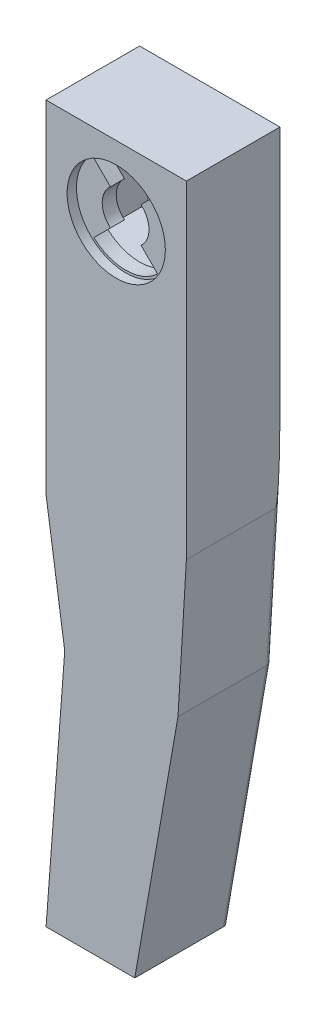
ISO-10303-21;
HEADER;
FILE_DESCRIPTION(('STEP AP214'),'2;1');
FILE_NAME('part.step','',(''),(''),'','','');
FILE_SCHEMA(('AUTOMOTIVE_DESIGN { 1 0 10303 214 1 1 1 1 }'));
ENDSEC;
DATA;
#1=APPLICATION_CONTEXT('core data for automotive mechanical design processes');
#2=APPLICATION_PROTOCOL_DEFINITION('international standard','automotive_design',2000,#1);
#3=PRODUCT_CONTEXT('',#1,'mechanical');
#4=PRODUCT('Part','Part','',(#3));
#5=PRODUCT_RELATED_PRODUCT_CATEGORY('part','',(#4));
#6=PRODUCT_DEFINITION_FORMATION('','',#4);
#7=PRODUCT_DEFINITION_CONTEXT('part definition',#1,'design');
#8=PRODUCT_DEFINITION('design','',#6,#7);
#9=PRODUCT_DEFINITION_SHAPE('','',#8);
#10=(LENGTH_UNIT() NAMED_UNIT(*) SI_UNIT(.MILLI.,.METRE.));
#11=(NAMED_UNIT(*) PLANE_ANGLE_UNIT() SI_UNIT($,.RADIAN.));
#12=(NAMED_UNIT(*) SI_UNIT($,.STERADIAN.) SOLID_ANGLE_UNIT());
#13=UNCERTAINTY_MEASURE_WITH_UNIT(LENGTH_MEASURE(1.E-05),#10,'distance_accuracy_value','');
#14=(GEOMETRIC_REPRESENTATION_CONTEXT(3) GLOBAL_UNCERTAINTY_ASSIGNED_CONTEXT((#13)) GLOBAL_UNIT_ASSIGNED_CONTEXT((#10,
#11,#12)) REPRESENTATION_CONTEXT('',''));
#15=CARTESIAN_POINT('',(0.,0.,0.));
#16=DIRECTION('',(0.,0.,1.));
#17=DIRECTION('',(1.,0.,0.));
#18=AXIS2_PLACEMENT_3D('',#15,#16,#17);
#19=CARTESIAN_POINT('',(-14.4473162010252,0.866838972061505,20.));
#20=DIRECTION('',(0.998204845465779,-0.0598922907279464,0.));
#21=DIRECTION('',(0.0598922907279464,0.998204845465779,0.));
#22=AXIS2_PLACEMENT_3D('',#19,#20,#21);
#23=PLANE('',#22);
#24=DIRECTION('',(0.,0.,-1.));
#25=VECTOR('',#24,1.);
#26=CARTESIAN_POINT('',(-18.7142857142857,-70.2493195822815,20.));
#27=LINE('',#26,#25);
#28=CARTESIAN_POINT('',(-18.7142857142857,-70.2493195822815,20.));
#29=VERTEX_POINT('',#28);
#30=CARTESIAN_POINT('',(-18.7142857142857,-70.2493195822815,1.));
#31=VERTEX_POINT('',#30);
#32=EDGE_CURVE('E234',#29,#31,#27,.T.);
#33=ORIENTED_EDGE('',*,*,#32,.T.);
#34=DIRECTION('',(-0.0598922907279464,-0.998204845465779,0.));
#35=VECTOR('',#34,1.);
#36=CARTESIAN_POINT('',(-16.9142857142857,-40.2493195822815,1.));
#37=LINE('',#36,#35);
#38=CARTESIAN_POINT('',(-16.9142857142857,-40.2493195822815,1.));
#39=VERTEX_POINT('',#38);
#40=EDGE_CURVE('E276',#31,#39,#37,.F.);
#41=ORIENTED_EDGE('',*,*,#40,.T.);
#42=DIRECTION('',(0.,0.,-1.));
#43=VECTOR('',#42,1.);
#44=CARTESIAN_POINT('',(-16.9142857142857,-40.2493195822815,20.));
#45=LINE('',#44,#43);
#46=CARTESIAN_POINT('',(-16.9142857142857,-40.2493195822815,20.));
#47=VERTEX_POINT('',#46);
#48=EDGE_CURVE('E255',#47,#39,#45,.T.);
#49=ORIENTED_EDGE('',*,*,#48,.F.);
#50=DIRECTION('',(-0.0598922907279464,-0.998204845465779,0.));
#51=VECTOR('',#50,1.);
#52=CARTESIAN_POINT('',(-14.4473162010252,0.866838972061505,20.));
#53=LINE('',#52,#51);
#54=EDGE_CURVE('E328',#47,#29,#53,.T.);
#55=ORIENTED_EDGE('',*,*,#54,.T.);
#56=EDGE_LOOP('',(#33,#41,#49,#55));
#57=FACE_BOUND('',#56,.T.);
#58=ADVANCED_FACE('F44',(#57),#23,.T.);
#59=CARTESIAN_POINT('',(-16.9142857142857,0.,20.));
#60=DIRECTION('',(-1.,0.,0.));
#61=DIRECTION('',(0.,-1.,0.));
#62=AXIS2_PLACEMENT_3D('',#59,#60,#61);
#63=PLANE('',#62);
#64=ORIENTED_EDGE('',*,*,#48,.T.);
#65=CARTESIAN_POINT('',(-16.9142857142857,-23.5526798671239,1.));
#66=DIRECTION('',(-1.,0.,0.));
#67=DIRECTION('',(0.,1.,0.));
#68=AXIS2_PLACEMENT_3D('',#65,#66,#67);
#69=ELLIPSE('',#68,16.6966397151578,1.);
#70=CARTESIAN_POINT('',(-16.9142857142857,-23.5526798671239,0.));
#71=VERTEX_POINT('',#70);
#72=EDGE_CURVE('E279',#39,#71,#69,.F.);
#73=ORIENTED_EDGE('',*,*,#72,.T.);
#74=DIRECTION('',(0.,1.,0.));
#75=VECTOR('',#74,1.);
#76=CARTESIAN_POINT('',(-16.9142857142857,0.,0.));
#77=LINE('',#76,#75);
#78=CARTESIAN_POINT('',(-16.9142857142857,29.8285714285714,0.));
#79=VERTEX_POINT('',#78);
#80=EDGE_CURVE('E335',#71,#79,#77,.T.);
#81=ORIENTED_EDGE('',*,*,#80,.T.);
#82=DIRECTION('',(0.,0.,-1.));
#83=VECTOR('',#82,1.);
#84=CARTESIAN_POINT('',(-16.9142857142857,29.8285714285714,20.));
#85=LINE('',#84,#83);
#86=CARTESIAN_POINT('',(-16.9142857142857,29.8285714285714,20.));
#87=VERTEX_POINT('',#86);
#88=EDGE_CURVE('E251',#87,#79,#85,.T.);
#89=ORIENTED_EDGE('',*,*,#88,.F.);
#90=DIRECTION('',(0.,1.,0.));
#91=VECTOR('',#90,1.);
#92=CARTESIAN_POINT('',(-16.9142857142857,0.,20.));
#93=LINE('',#92,#91);
#94=EDGE_CURVE('E333',#47,#87,#93,.T.);
#95=ORIENTED_EDGE('',*,*,#94,.F.);
#96=EDGE_LOOP('',(#64,#73,#81,#89,#95));
#97=FACE_BOUND('',#96,.T.);
#98=ADVANCED_FACE('F541',(#97),#63,.F.);
#99=CARTESIAN_POINT('',(0.,29.8285714285714,20.));
#100=DIRECTION('',(0.,-1.,0.));
#101=DIRECTION('',(1.,0.,0.));
#102=AXIS2_PLACEMENT_3D('',#99,#100,#101);
#103=PLANE('',#102);
#104=DIRECTION('',(-1.,0.,0.));
#105=VECTOR('',#104,1.);
#106=CARTESIAN_POINT('',(0.,29.8285714285714,0.));
#107=LINE('',#106,#105);
#108=CARTESIAN_POINT('',(-46.9142857142857,29.8285714285714,0.));
#109=VERTEX_POINT('',#108);
#110=EDGE_CURVE('E329',#79,#109,#107,.T.);
#111=ORIENTED_EDGE('',*,*,#110,.T.);
#112=DIRECTION('',(0.,0.,-1.));
#113=VECTOR('',#112,1.);
#114=CARTESIAN_POINT('',(-46.9142857142857,29.8285714285714,20.));
#115=LINE('',#114,#113);
#116=CARTESIAN_POINT('',(-46.9142857142857,29.8285714285714,20.));
#117=VERTEX_POINT('',#116);
#118=EDGE_CURVE('E247',#117,#109,#115,.T.);
#119=ORIENTED_EDGE('',*,*,#118,.F.);
#120=DIRECTION('',(-1.,0.,0.));
#121=VECTOR('',#120,1.);
#122=CARTESIAN_POINT('',(0.,29.8285714285714,20.));
#123=LINE('',#122,#121);
#124=EDGE_CURVE('E347',#87,#117,#123,.T.);
#125=ORIENTED_EDGE('',*,*,#124,.F.);
#126=ORIENTED_EDGE('',*,*,#88,.T.);
#127=EDGE_LOOP('',(#111,#119,#125,#126));
#128=FACE_BOUND('',#127,.T.);
#129=ADVANCED_FACE('F548',(#128),#103,.F.);
#130=CARTESIAN_POINT('',(-46.9142857142857,0.,20.));
#131=DIRECTION('',(-1.,0.,0.));
#132=DIRECTION('',(0.,-1.,0.));
#133=AXIS2_PLACEMENT_3D('',#130,#131,#132);
#134=PLANE('',#133);
#135=DIRECTION('',(0.,1.,0.));
#136=VECTOR('',#135,1.);
#137=CARTESIAN_POINT('',(-46.9142857142857,0.,0.));
#138=LINE('',#137,#136);
#139=CARTESIAN_POINT('',(-46.9142857142857,-36.4289982575647,0.));
#140=VERTEX_POINT('',#139);
#141=EDGE_CURVE('E322',#140,#109,#138,.T.);
#142=ORIENTED_EDGE('',*,*,#141,.F.);
#143=CARTESIAN_POINT('',(-46.9142857142857,-36.4289982575647,1.));
#144=DIRECTION('',(-1.,0.,0.));
#145=DIRECTION('',(0.,-1.,0.));
#146=AXIS2_PLACEMENT_3D('',#143,#144,#145);
#147=ELLIPSE('',#146,6.82032132471675,1.);
#148=CARTESIAN_POINT('',(-46.9142857142857,-43.2493195822815,1.));
#149=VERTEX_POINT('',#148);
#150=EDGE_CURVE('E286',#140,#149,#147,.T.);
#151=ORIENTED_EDGE('',*,*,#150,.T.);
#152=DIRECTION('',(0.,0.,-1.));
#153=VECTOR('',#152,1.);
#154=CARTESIAN_POINT('',(-46.9142857142857,-43.2493195822815,20.));
#155=LINE('',#154,#153);
#156=CARTESIAN_POINT('',(-46.9142857142857,-43.2493195822815,20.));
#157=VERTEX_POINT('',#156);
#158=EDGE_CURVE('E238',#157,#149,#155,.T.);
#159=ORIENTED_EDGE('',*,*,#158,.F.);
#160=DIRECTION('',(0.,1.,0.));
#161=VECTOR('',#160,1.);
#162=CARTESIAN_POINT('',(-46.9142857142857,0.,20.));
#163=LINE('',#162,#161);
#164=EDGE_CURVE('E321',#157,#117,#163,.T.);
#165=ORIENTED_EDGE('',*,*,#164,.T.);
#166=ORIENTED_EDGE('',*,*,#118,.T.);
#167=EDGE_LOOP('',(#142,#151,#159,#165,#166));
#168=FACE_BOUND('',#167,.T.);
#169=ADVANCED_FACE('F320',(#168),#134,.T.);
#170=CARTESIAN_POINT('',(-52.1784529149063,-7.73402227269673,20.));
#171=DIRECTION('',(0.989192793476027,0.146620657941146,0.));
#172=DIRECTION('',(-0.146620657941146,0.989192793476027,0.));
#173=AXIS2_PLACEMENT_3D('',#170,#171,#172);
#174=PLANE('',#173);
#175=ORIENTED_EDGE('',*,*,#158,.T.);
#176=DIRECTION('',(0.146620657941146,-0.989192793476027,0.));
#177=VECTOR('',#176,1.);
#178=CARTESIAN_POINT('',(-52.1784529149063,-7.73402227269673,1.));
#179=LINE('',#178,#177);
#180=CARTESIAN_POINT('',(-42.9238226223731,-70.1714285714286,1.));
#181=VERTEX_POINT('',#180);
#182=EDGE_CURVE('E282',#149,#181,#179,.T.);
#183=ORIENTED_EDGE('',*,*,#182,.T.);
#184=DIRECTION('',(0.,0.,-1.));
#185=VECTOR('',#184,1.);
#186=CARTESIAN_POINT('',(-42.9238226223731,-70.1714285714286,20.));
#187=LINE('',#186,#185);
#188=CARTESIAN_POINT('',(-42.9238226223731,-70.1714285714286,20.));
#189=VERTEX_POINT('',#188);
#190=EDGE_CURVE('E233',#189,#181,#187,.T.);
#191=ORIENTED_EDGE('',*,*,#190,.F.);
#192=DIRECTION('',(0.146620657941146,-0.989192793476027,0.));
#193=VECTOR('',#192,1.);
#194=CARTESIAN_POINT('',(-52.1784529149063,-7.73402227269673,20.));
#195=LINE('',#194,#193);
#196=EDGE_CURVE('E226',#157,#189,#195,.T.);
#197=ORIENTED_EDGE('',*,*,#196,.F.);
#198=EDGE_LOOP('',(#175,#183,#191,#197));
#199=FACE_BOUND('',#198,.T.);
#200=ADVANCED_FACE('F316',(#199),#174,.F.);
#201=CARTESIAN_POINT('',(-37.4366454558107,2.81453443479666,20.));
#202=DIRECTION('',(0.997185812758595,-0.0749696927630072,0.));
#203=DIRECTION('',(0.0749696927630072,0.997185812758595,0.));
#204=AXIS2_PLACEMENT_3D('',#201,#202,#203);
#205=PLANE('',#204);
#206=ORIENTED_EDGE('',*,*,#190,.T.);
#207=DIRECTION('',(-0.0749696927630072,-0.997185812758595,0.));
#208=VECTOR('',#207,1.);
#209=CARTESIAN_POINT('',(-37.4366454558107,2.81453443479666,1.));
#210=LINE('',#209,#208);
#211=CARTESIAN_POINT('',(-46.9142857142857,-123.249319582281,1.));
#212=VERTEX_POINT('',#211);
#213=EDGE_CURVE('E70',#181,#212,#210,.T.);
#214=ORIENTED_EDGE('',*,*,#213,.T.);
#215=DIRECTION('',(0.,0.,-1.));
#216=VECTOR('',#215,1.);
#217=CARTESIAN_POINT('',(-46.9142857142857,-123.249319582281,20.));
#218=LINE('',#217,#216);
#219=CARTESIAN_POINT('',(-46.9142857142857,-123.249319582281,20.));
#220=VERTEX_POINT('',#219);
#221=EDGE_CURVE('E211',#220,#212,#218,.T.);
#222=ORIENTED_EDGE('',*,*,#221,.F.);
#223=DIRECTION('',(-0.0749696927630072,-0.997185812758595,0.));
#224=VECTOR('',#223,1.);
#225=CARTESIAN_POINT('',(-37.4366454558107,2.81453443479666,20.));
#226=LINE('',#225,#224);
#227=EDGE_CURVE('E221',#189,#220,#226,.T.);
#228=ORIENTED_EDGE('',*,*,#227,.F.);
#229=EDGE_LOOP('',(#206,#214,#222,#228));
#230=FACE_BOUND('',#229,.T.);
#231=ADVANCED_FACE('F231',(#230),#205,.F.);
#232=CARTESIAN_POINT('',(-6.28007246748397,1.09452691576149,20.));
#233=DIRECTION('',(0.985149715028507,-0.171697521762111,0.));
#234=DIRECTION('',(0.171697521762111,0.985149715028507,0.));
#235=AXIS2_PLACEMENT_3D('',#232,#233,#234);
#236=PLANE('',#235);
#237=DIRECTION('',(0.,0.,-1.));
#238=VECTOR('',#237,1.);
#239=CARTESIAN_POINT('',(-27.9514285714286,-123.249319582282,33.));
#240=LINE('',#239,#238);
#241=CARTESIAN_POINT('',(-27.9514285714286,-123.249319582282,20.));
#242=VERTEX_POINT('',#241);
#243=CARTESIAN_POINT('',(-27.9514285714286,-123.249319582282,1.));
#244=VERTEX_POINT('',#243);
#245=EDGE_CURVE('E213',#242,#244,#240,.T.);
#246=ORIENTED_EDGE('',*,*,#245,.T.);
#247=DIRECTION('',(-0.171697521762111,-0.985149715028507,0.));
#248=VECTOR('',#247,1.);
#249=CARTESIAN_POINT('',(-18.7142857142857,-70.2493195822815,1.));
#250=LINE('',#249,#248);
#251=EDGE_CURVE('E11',#244,#31,#250,.F.);
#252=ORIENTED_EDGE('',*,*,#251,.T.);
#253=ORIENTED_EDGE('',*,*,#32,.F.);
#254=DIRECTION('',(-0.171697521762111,-0.985149715028508,0.));
#255=VECTOR('',#254,1.);
#256=CARTESIAN_POINT('',(-6.28007246748397,1.09452691576149,20.));
#257=LINE('',#256,#255);
#258=EDGE_CURVE('E229',#29,#242,#257,.T.);
#259=ORIENTED_EDGE('',*,*,#258,.T.);
#260=EDGE_LOOP('',(#246,#252,#253,#259));
#261=FACE_BOUND('',#260,.T.);
#262=ADVANCED_FACE('F603',(#261),#236,.T.);
#263=CARTESIAN_POINT('',(0.,0.,20.));
#264=DIRECTION('',(0.,0.,1.));
#265=DIRECTION('',(1.,0.,0.));
#266=AXIS2_PLACEMENT_3D('',#263,#264,#265);
#267=PLANE('',#266);
#268=DIRECTION('',(-1.,0.,0.));
#269=VECTOR('',#268,1.);
#270=CARTESIAN_POINT('',(0.,-123.249319582282,20.));
#271=LINE('',#270,#269);
#272=EDGE_CURVE('E208',#242,#220,#271,.T.);
#273=ORIENTED_EDGE('',*,*,#272,.F.);
#274=ORIENTED_EDGE('',*,*,#258,.F.);
#275=ORIENTED_EDGE('',*,*,#54,.F.);
#276=ORIENTED_EDGE('',*,*,#94,.T.);
#277=ORIENTED_EDGE('',*,*,#124,.T.);
#278=ORIENTED_EDGE('',*,*,#164,.F.);
#279=ORIENTED_EDGE('',*,*,#196,.T.);
#280=ORIENTED_EDGE('',*,*,#227,.T.);
#281=EDGE_LOOP('',(#273,#274,#275,#276,#277,#278,#279,#280));
#282=FACE_BOUND('',#281,.T.);
#283=CARTESIAN_POINT('',(-31.9142857142857,14.8285714285714,20.));
#284=DIRECTION('',(0.,0.,1.));
#285=DIRECTION('',(1.,0.,0.));
#286=AXIS2_PLACEMENT_3D('',#283,#284,#285);
#287=CIRCLE('',#286,10.5);
#288=CARTESIAN_POINT('',(-21.4142857142857,14.8285714285714,20.));
#289=VERTEX_POINT('',#288);
#290=EDGE_CURVE('E340',#289,#289,#287,.T.);
#291=ORIENTED_EDGE('',*,*,#290,.F.);
#292=EDGE_LOOP('',(#291));
#293=FACE_BOUND('',#292,.T.);
#294=ADVANCED_FACE('F222',(#282,#293),#267,.T.);
#295=CARTESIAN_POINT('',(0.,0.,0.));
#296=DIRECTION('',(0.,0.,1.));
#297=DIRECTION('',(1.,0.,0.));
#298=AXIS2_PLACEMENT_3D('',#295,#296,#297);
#299=PLANE('',#298);
#300=DIRECTION('',(1.,0.,0.));
#301=VECTOR('',#300,1.);
#302=CARTESIAN_POINT('',(0.,1.62857142857145,0.));
#303=LINE('',#302,#301);
#304=CARTESIAN_POINT('',(-45.1142857142857,1.62857142857145,0.));
#305=VERTEX_POINT('',#304);
#306=CARTESIAN_POINT('',(-18.7142857142857,1.62857142857145,0.));
#307=VERTEX_POINT('',#306);
#308=EDGE_CURVE('E469',#305,#307,#303,.T.);
#309=ORIENTED_EDGE('',*,*,#308,.T.);
#310=DIRECTION('',(0.,-1.,0.));
#311=VECTOR('',#310,1.);
#312=CARTESIAN_POINT('',(-18.7142857142857,0.,0.));
#313=LINE('',#312,#311);
#314=CARTESIAN_POINT('',(-18.7142857142857,28.0285714285714,0.));
#315=VERTEX_POINT('',#314);
#316=EDGE_CURVE('E218',#315,#307,#313,.T.);
#317=ORIENTED_EDGE('',*,*,#316,.F.);
#318=DIRECTION('',(1.,0.,0.));
#319=VECTOR('',#318,1.);
#320=CARTESIAN_POINT('',(0.,28.0285714285714,0.));
#321=LINE('',#320,#319);
#322=CARTESIAN_POINT('',(-45.1142857142857,28.0285714285714,0.));
#323=VERTEX_POINT('',#322);
#324=EDGE_CURVE('E478',#323,#315,#321,.T.);
#325=ORIENTED_EDGE('',*,*,#324,.F.);
#326=DIRECTION('',(0.,-1.,0.));
#327=VECTOR('',#326,1.);
#328=CARTESIAN_POINT('',(-45.1142857142857,0.,0.));
#329=LINE('',#328,#327);
#330=EDGE_CURVE('E474',#323,#305,#329,.T.);
#331=ORIENTED_EDGE('',*,*,#330,.T.);
#332=EDGE_LOOP('',(#309,#317,#325,#331));
#333=FACE_BOUND('',#332,.T.);
#334=DIRECTION('',(-0.0749696927630072,-0.997185812758595,0.));
#335=VECTOR('',#334,1.);
#336=CARTESIAN_POINT('',(-36.4394596430522,2.73956474203365,0.));
#337=LINE('',#336,#335);
#338=CARTESIAN_POINT('',(-45.9114635850442,-123.249319582281,0.));
#339=VERTEX_POINT('',#338);
#340=CARTESIAN_POINT('',(-41.9182735698679,-70.1351572584372,0.));
#341=VERTEX_POINT('',#340);
#342=EDGE_CURVE('E270',#339,#341,#337,.F.);
#343=ORIENTED_EDGE('',*,*,#342,.T.);
#344=DIRECTION('',(0.146620657941146,-0.989192793476027,0.));
#345=VECTOR('',#344,1.);
#346=CARTESIAN_POINT('',(-51.1892601214303,-7.58740161475559,0.));
#347=LINE('',#346,#345);
#348=EDGE_CURVE('E273',#341,#140,#347,.F.);
#349=ORIENTED_EDGE('',*,*,#348,.T.);
#350=ORIENTED_EDGE('',*,*,#141,.T.);
#351=ORIENTED_EDGE('',*,*,#110,.F.);
#352=ORIENTED_EDGE('',*,*,#80,.F.);
#353=DIRECTION('',(-0.0598922907279464,-0.998204845465779,0.));
#354=VECTOR('',#353,1.);
#355=CARTESIAN_POINT('',(-19.7124905597515,-70.1894272915535,0.));
#356=LINE('',#355,#354);
#357=CARTESIAN_POINT('',(-19.7091143245914,-70.1331567055525,0.));
#358=VERTEX_POINT('',#357);
#359=EDGE_CURVE('E266',#71,#358,#356,.T.);
#360=ORIENTED_EDGE('',*,*,#359,.T.);
#361=DIRECTION('',(-0.171697521762111,-0.985149715028507,0.));
#362=VECTOR('',#361,1.);
#363=CARTESIAN_POINT('',(-28.9365782864571,-123.077622060519,0.));
#364=LINE('',#363,#362);
#365=CARTESIAN_POINT('',(-28.9665027116785,-123.249319582281,0.));
#366=VERTEX_POINT('',#365);
#367=EDGE_CURVE('E263',#358,#366,#364,.T.);
#368=ORIENTED_EDGE('',*,*,#367,.T.);
#369=DIRECTION('',(1.,0.,0.));
#370=VECTOR('',#369,1.);
#371=CARTESIAN_POINT('',(0.,-123.249319582282,0.));
#372=LINE('',#371,#370);
#373=EDGE_CURVE('E499',#339,#366,#372,.T.);
#374=ORIENTED_EDGE('',*,*,#373,.F.);
#375=EDGE_LOOP('',(#343,#349,#350,#351,#352,#360,#368,#374));
#376=FACE_BOUND('',#375,.T.);
#377=ADVANCED_FACE('F602',(#333,#376),#299,.F.);
#378=CARTESIAN_POINT('',(-31.9142857142857,14.8285714285714,20.));
#379=DIRECTION('',(0.,0.,-1.));
#380=DIRECTION('',(-1.,0.,0.));
#381=AXIS2_PLACEMENT_3D('',#378,#379,#380);
#382=CYLINDRICAL_SURFACE('',#381,10.5);
#383=CARTESIAN_POINT('',(-31.9142857142857,14.8285714285714,18.));
#384=DIRECTION('',(0.,0.,1.));
#385=DIRECTION('',(1.,0.,0.));
#386=AXIS2_PLACEMENT_3D('',#383,#384,#385);
#387=CIRCLE('',#386,10.5);
#388=CARTESIAN_POINT('',(-21.4142857142857,14.8285714285714,18.));
#389=VERTEX_POINT('',#388);
#390=EDGE_CURVE('E259',#389,#389,#387,.T.);
#391=ORIENTED_EDGE('',*,*,#390,.F.);
#392=EDGE_LOOP('',(#391));
#393=FACE_BOUND('',#392,.T.);
#394=ORIENTED_EDGE('',*,*,#290,.T.);
#395=EDGE_LOOP('',(#394));
#396=FACE_BOUND('',#395,.T.);
#397=ADVANCED_FACE('F763',(#393,#396),#382,.F.);
#398=CARTESIAN_POINT('',(-31.9142857142857,14.8285714285714,18.));
#399=DIRECTION('',(0.,0.,-1.));
#400=DIRECTION('',(-1.,0.,0.));
#401=AXIS2_PLACEMENT_3D('',#398,#399,#400);
#402=CYLINDRICAL_SURFACE('',#401,5.);
#403=CARTESIAN_POINT('',(-31.9142857142857,14.8285714285714,15.));
#404=DIRECTION('',(0.,0.,1.));
#405=DIRECTION('',(1.,0.,0.));
#406=AXIS2_PLACEMENT_3D('',#403,#404,#405);
#407=CIRCLE('',#406,5.);
#408=CARTESIAN_POINT('',(-28.6057259152176,11.0797806827455,15.));
#409=VERTEX_POINT('',#408);
#410=CARTESIAN_POINT('',(-28.378751808353,18.3641053345042,15.));
#411=VERTEX_POINT('',#410);
#412=EDGE_CURVE('E451',#409,#411,#407,.T.);
#413=ORIENTED_EDGE('',*,*,#412,.F.);
#414=DIRECTION('',(0.,0.,-1.));
#415=VECTOR('',#414,1.);
#416=CARTESIAN_POINT('',(-28.6057259152176,11.0797806827455,18.));
#417=LINE('',#416,#415);
#418=CARTESIAN_POINT('',(-28.6057259152176,11.0797806827455,18.));
#419=VERTEX_POINT('',#418);
#420=EDGE_CURVE('E355',#419,#409,#417,.T.);
#421=ORIENTED_EDGE('',*,*,#420,.F.);
#422=CARTESIAN_POINT('',(-31.9142857142857,14.8285714285714,18.));
#423=DIRECTION('',(0.,0.,1.));
#424=DIRECTION('',(1.,0.,0.));
#425=AXIS2_PLACEMENT_3D('',#422,#423,#424);
#426=CIRCLE('',#425,5.);
#427=CARTESIAN_POINT('',(-28.378751808353,18.3641053345042,18.));
#428=VERTEX_POINT('',#427);
#429=EDGE_CURVE('E420',#419,#428,#426,.T.);
#430=ORIENTED_EDGE('',*,*,#429,.T.);
#431=DIRECTION('',(0.,0.,-1.));
#432=VECTOR('',#431,1.);
#433=CARTESIAN_POINT('',(-28.378751808353,18.3641053345042,18.));
#434=LINE('',#433,#432);
#435=EDGE_CURVE('E387',#428,#411,#434,.T.);
#436=ORIENTED_EDGE('',*,*,#435,.T.);
#437=EDGE_LOOP('',(#413,#421,#430,#436));
#438=FACE_BOUND('',#437,.T.);
#439=ADVANCED_FACE('F752',(#438),#402,.F.);
#440=CARTESIAN_POINT('',(-8.76297261623604,-8.76297261623606,18.));
#441=DIRECTION('',(0.707106781186547,0.707106781186548,0.));
#442=DIRECTION('',(-0.707106781186548,0.707106781186547,0.));
#443=AXIS2_PLACEMENT_3D('',#440,#441,#442);
#444=PLANE('',#443);
#445=ORIENTED_EDGE('',*,*,#420,.T.);
#446=DIRECTION('',(0.707106781186548,-0.707106781186547,0.));
#447=VECTOR('',#446,1.);
#448=CARTESIAN_POINT('',(-8.76297261623604,-8.76297261623606,15.));
#449=LINE('',#448,#447);
#450=CARTESIAN_POINT('',(-25.066760196614,7.54081496414188,15.));
#451=VERTEX_POINT('',#450);
#452=EDGE_CURVE('E447',#409,#451,#449,.T.);
#453=ORIENTED_EDGE('',*,*,#452,.T.);
#454=DIRECTION('',(0.,0.,-1.));
#455=VECTOR('',#454,1.);
#456=CARTESIAN_POINT('',(-25.066760196614,7.54081496414188,18.));
#457=LINE('',#456,#455);
#458=CARTESIAN_POINT('',(-25.066760196614,7.54081496414188,18.));
#459=VERTEX_POINT('',#458);
#460=EDGE_CURVE('E359',#459,#451,#457,.T.);
#461=ORIENTED_EDGE('',*,*,#460,.F.);
#462=DIRECTION('',(0.707106781186548,-0.707106781186547,0.));
#463=VECTOR('',#462,1.);
#464=CARTESIAN_POINT('',(-8.76297261623604,-8.76297261623606,18.));
#465=LINE('',#464,#463);
#466=EDGE_CURVE('E417',#419,#459,#465,.T.);
#467=ORIENTED_EDGE('',*,*,#466,.F.);
#468=EDGE_LOOP('',(#445,#453,#461,#467));
#469=FACE_BOUND('',#468,.T.);
#470=ADVANCED_FACE('F741',(#469),#444,.F.);
#471=CARTESIAN_POINT('',(-31.9142857142857,14.8285714285714,18.));
#472=DIRECTION('',(0.,0.,-1.));
#473=DIRECTION('',(-1.,0.,0.));
#474=AXIS2_PLACEMENT_3D('',#471,#472,#473);
#475=CYLINDRICAL_SURFACE('',#474,10.);
#476=CARTESIAN_POINT('',(-31.9142857142857,14.8285714285714,15.));
#477=DIRECTION('',(0.,0.,1.));
#478=DIRECTION('',(1.,0.,0.));
#479=AXIS2_PLACEMENT_3D('',#476,#477,#478);
#480=CIRCLE('',#479,10.);
#481=CARTESIAN_POINT('',(-38.6930913069153,7.47685089951612,15.));
#482=VERTEX_POINT('',#481);
#483=EDGE_CURVE('E444',#482,#451,#480,.T.);
#484=ORIENTED_EDGE('',*,*,#483,.F.);
#485=DIRECTION('',(0.,0.,-1.));
#486=VECTOR('',#485,1.);
#487=CARTESIAN_POINT('',(-38.6930913069153,7.47685089951612,18.));
#488=LINE('',#487,#486);
#489=CARTESIAN_POINT('',(-38.6930913069153,7.47685089951612,18.));
#490=VERTEX_POINT('',#489);
#491=EDGE_CURVE('E363',#490,#482,#488,.T.);
#492=ORIENTED_EDGE('',*,*,#491,.F.);
#493=CARTESIAN_POINT('',(-31.9142857142857,14.8285714285714,18.));
#494=DIRECTION('',(0.,0.,1.));
#495=DIRECTION('',(1.,0.,0.));
#496=AXIS2_PLACEMENT_3D('',#493,#494,#495);
#497=CIRCLE('',#496,10.);
#498=EDGE_CURVE('E413',#490,#459,#497,.T.);
#499=ORIENTED_EDGE('',*,*,#498,.T.);
#500=ORIENTED_EDGE('',*,*,#460,.T.);
#501=EDGE_LOOP('',(#484,#492,#499,#500));
#502=FACE_BOUND('',#501,.T.);
#503=ADVANCED_FACE('F730',(#502),#475,.F.);
#504=CARTESIAN_POINT('',(-23.0849711032157,23.0849711032157,18.));
#505=DIRECTION('',(0.707106781186548,-0.707106781186547,0.));
#506=DIRECTION('',(0.707106781186547,0.707106781186548,0.));
#507=AXIS2_PLACEMENT_3D('',#504,#505,#506);
#508=PLANE('',#507);
#509=DIRECTION('',(-0.707106781186547,-0.707106781186548,0.));
#510=VECTOR('',#509,1.);
#511=CARTESIAN_POINT('',(-23.0849711032157,23.0849711032157,15.));
#512=LINE('',#511,#510);
#513=CARTESIAN_POINT('',(-35.1517383071989,11.0182038992326,15.));
#514=VERTEX_POINT('',#513);
#515=EDGE_CURVE('E441',#514,#482,#512,.T.);
#516=ORIENTED_EDGE('',*,*,#515,.F.);
#517=DIRECTION('',(0.,0.,-1.));
#518=VECTOR('',#517,1.);
#519=CARTESIAN_POINT('',(-35.1517383071989,11.0182038992326,18.));
#520=LINE('',#519,#518);
#521=CARTESIAN_POINT('',(-35.1517383071989,11.0182038992326,18.));
#522=VERTEX_POINT('',#521);
#523=EDGE_CURVE('E367',#522,#514,#520,.T.);
#524=ORIENTED_EDGE('',*,*,#523,.F.);
#525=DIRECTION('',(-0.707106781186547,-0.707106781186548,0.));
#526=VECTOR('',#525,1.);
#527=CARTESIAN_POINT('',(-23.0849711032157,23.0849711032157,18.));
#528=LINE('',#527,#526);
#529=EDGE_CURVE('E409',#522,#490,#528,.T.);
#530=ORIENTED_EDGE('',*,*,#529,.T.);
#531=ORIENTED_EDGE('',*,*,#491,.T.);
#532=EDGE_LOOP('',(#516,#524,#530,#531));
#533=FACE_BOUND('',#532,.T.);
#534=ADVANCED_FACE('F719',(#533),#508,.T.);
#535=CARTESIAN_POINT('',(-31.9142857142857,14.8285714285714,18.));
#536=DIRECTION('',(0.,0.,-1.));
#537=DIRECTION('',(-1.,0.,0.));
#538=AXIS2_PLACEMENT_3D('',#535,#536,#537);
#539=CYLINDRICAL_SURFACE('',#538,5.);
#540=CARTESIAN_POINT('',(-31.9142857142857,14.8285714285714,15.));
#541=DIRECTION('',(0.,0.,1.));
#542=DIRECTION('',(1.,0.,0.));
#543=AXIS2_PLACEMENT_3D('',#540,#541,#542);
#544=CIRCLE('',#543,5.);
#545=CARTESIAN_POINT('',(-35.1517383071989,18.6389389579103,15.));
#546=VERTEX_POINT('',#545);
#547=EDGE_CURVE('E438',#546,#514,#544,.T.);
#548=ORIENTED_EDGE('',*,*,#547,.F.);
#549=DIRECTION('',(0.,0.,-1.));
#550=VECTOR('',#549,1.);
#551=CARTESIAN_POINT('',(-35.1517383071989,18.6389389579103,18.));
#552=LINE('',#551,#550);
#553=CARTESIAN_POINT('',(-35.1517383071989,18.6389389579103,18.));
#554=VERTEX_POINT('',#553);
#555=EDGE_CURVE('E371',#554,#546,#552,.T.);
#556=ORIENTED_EDGE('',*,*,#555,.F.);
#557=CARTESIAN_POINT('',(-31.9142857142857,14.8285714285714,18.));
#558=DIRECTION('',(0.,0.,1.));
#559=DIRECTION('',(1.,0.,0.));
#560=AXIS2_PLACEMENT_3D('',#557,#558,#559);
#561=CIRCLE('',#560,5.);
#562=EDGE_CURVE('E405',#554,#522,#561,.T.);
#563=ORIENTED_EDGE('',*,*,#562,.T.);
#564=ORIENTED_EDGE('',*,*,#523,.T.);
#565=EDGE_LOOP('',(#548,#556,#563,#564));
#566=FACE_BOUND('',#565,.T.);
#567=ADVANCED_FACE('F708',(#566),#539,.F.);
#568=CARTESIAN_POINT('',(-8.25639967464435,-8.25639967464433,18.));
#569=DIRECTION('',(-0.707106781186548,-0.707106781186547,0.));
#570=DIRECTION('',(0.707106781186547,-0.707106781186548,0.));
#571=AXIS2_PLACEMENT_3D('',#568,#569,#570);
#572=PLANE('',#571);
#573=ORIENTED_EDGE('',*,*,#555,.T.);
#574=DIRECTION('',(-0.707106781186547,0.707106781186548,0.));
#575=VECTOR('',#574,1.);
#576=CARTESIAN_POINT('',(-8.25639967464435,-8.25639967464433,15.));
#577=LINE('',#576,#575);
#578=CARTESIAN_POINT('',(-38.6930913069154,22.1802919576267,15.));
#579=VERTEX_POINT('',#578);
#580=EDGE_CURVE('E434',#546,#579,#577,.T.);
#581=ORIENTED_EDGE('',*,*,#580,.T.);
#582=DIRECTION('',(0.,0.,-1.));
#583=VECTOR('',#582,1.);
#584=CARTESIAN_POINT('',(-38.6930913069154,22.1802919576267,18.));
#585=LINE('',#584,#583);
#586=CARTESIAN_POINT('',(-38.6930913069154,22.1802919576267,18.));
#587=VERTEX_POINT('',#586);
#588=EDGE_CURVE('E375',#587,#579,#585,.T.);
#589=ORIENTED_EDGE('',*,*,#588,.F.);
#590=DIRECTION('',(-0.707106781186547,0.707106781186548,0.));
#591=VECTOR('',#590,1.);
#592=CARTESIAN_POINT('',(-8.25639967464435,-8.25639967464433,18.));
#593=LINE('',#592,#591);
#594=EDGE_CURVE('E402',#554,#587,#593,.T.);
#595=ORIENTED_EDGE('',*,*,#594,.F.);
#596=EDGE_LOOP('',(#573,#581,#589,#595));
#597=FACE_BOUND('',#596,.T.);
#598=ADVANCED_FACE('F697',(#597),#572,.F.);
#599=CARTESIAN_POINT('',(-31.9142857142857,14.8285714285714,18.));
#600=DIRECTION('',(0.,0.,-1.));
#601=DIRECTION('',(-1.,0.,0.));
#602=AXIS2_PLACEMENT_3D('',#599,#600,#601);
#603=CYLINDRICAL_SURFACE('',#602,10.);
#604=CARTESIAN_POINT('',(-31.9142857142857,14.8285714285714,15.));
#605=DIRECTION('',(0.,0.,1.));
#606=DIRECTION('',(1.,0.,0.));
#607=AXIS2_PLACEMENT_3D('',#604,#605,#606);
#608=CIRCLE('',#607,10.);
#609=CARTESIAN_POINT('',(-25.0985746011971,22.1460902719308,15.));
#610=VERTEX_POINT('',#609);
#611=EDGE_CURVE('E431',#610,#579,#608,.T.);
#612=ORIENTED_EDGE('',*,*,#611,.F.);
#613=DIRECTION('',(0.,0.,-1.));
#614=VECTOR('',#613,1.);
#615=CARTESIAN_POINT('',(-25.0985746011971,22.1460902719308,18.));
#616=LINE('',#615,#614);
#617=CARTESIAN_POINT('',(-25.0985746011971,22.1460902719308,18.));
#618=VERTEX_POINT('',#617);
#619=EDGE_CURVE('E379',#618,#610,#616,.T.);
#620=ORIENTED_EDGE('',*,*,#619,.F.);
#621=CARTESIAN_POINT('',(-31.9142857142857,14.8285714285714,18.));
#622=DIRECTION('',(0.,0.,1.));
#623=DIRECTION('',(1.,0.,0.));
#624=AXIS2_PLACEMENT_3D('',#621,#622,#623);
#625=CIRCLE('',#624,10.);
#626=EDGE_CURVE('E398',#618,#587,#625,.T.);
#627=ORIENTED_EDGE('',*,*,#626,.T.);
#628=ORIENTED_EDGE('',*,*,#588,.T.);
#629=EDGE_LOOP('',(#612,#620,#627,#628));
#630=FACE_BOUND('',#629,.T.);
#631=ADVANCED_FACE('F686',(#630),#603,.F.);
#632=CARTESIAN_POINT('',(-23.622332436564,23.622332436564,18.));
#633=DIRECTION('',(-0.707106781186547,0.707106781186548,0.));
#634=DIRECTION('',(-0.707106781186548,-0.707106781186547,0.));
#635=AXIS2_PLACEMENT_3D('',#632,#633,#634);
#636=PLANE('',#635);
#637=DIRECTION('',(0.707106781186548,0.707106781186547,0.));
#638=VECTOR('',#637,1.);
#639=CARTESIAN_POINT('',(-23.622332436564,23.622332436564,15.));
#640=LINE('',#639,#638);
#641=CARTESIAN_POINT('',(-28.6057259152176,18.6389389579103,15.));
#642=VERTEX_POINT('',#641);
#643=EDGE_CURVE('E428',#642,#610,#640,.T.);
#644=ORIENTED_EDGE('',*,*,#643,.F.);
#645=DIRECTION('',(0.,0.,-1.));
#646=VECTOR('',#645,1.);
#647=CARTESIAN_POINT('',(-28.6057259152176,18.6389389579103,18.));
#648=LINE('',#647,#646);
#649=CARTESIAN_POINT('',(-28.6057259152176,18.6389389579103,18.));
#650=VERTEX_POINT('',#649);
#651=EDGE_CURVE('E383',#650,#642,#648,.T.);
#652=ORIENTED_EDGE('',*,*,#651,.F.);
#653=DIRECTION('',(0.707106781186548,0.707106781186547,0.));
#654=VECTOR('',#653,1.);
#655=CARTESIAN_POINT('',(-23.622332436564,23.622332436564,18.));
#656=LINE('',#655,#654);
#657=EDGE_CURVE('E394',#650,#618,#656,.T.);
#658=ORIENTED_EDGE('',*,*,#657,.T.);
#659=ORIENTED_EDGE('',*,*,#619,.T.);
#660=EDGE_LOOP('',(#644,#652,#658,#659));
#661=FACE_BOUND('',#660,.T.);
#662=ADVANCED_FACE('F674',(#661),#636,.T.);
#663=CARTESIAN_POINT('',(-7.85506488184657,-6.48718418738143,18.));
#664=DIRECTION('',(0.771047654122615,0.636777445479982,0.));
#665=DIRECTION('',(-0.636777445479982,0.771047654122615,0.));
#666=AXIS2_PLACEMENT_3D('',#663,#664,#665);
#667=PLANE('',#666);
#668=ORIENTED_EDGE('',*,*,#651,.T.);
#669=DIRECTION('',(0.636777445479982,-0.771047654122615,0.));
#670=VECTOR('',#669,1.);
#671=CARTESIAN_POINT('',(-7.85506488184657,-6.48718418738143,15.));
#672=LINE('',#671,#670);
#673=EDGE_CURVE('E424',#642,#411,#672,.T.);
#674=ORIENTED_EDGE('',*,*,#673,.T.);
#675=ORIENTED_EDGE('',*,*,#435,.F.);
#676=DIRECTION('',(0.636777445479982,-0.771047654122615,0.));
#677=VECTOR('',#676,1.);
#678=CARTESIAN_POINT('',(-7.85506488184657,-6.48718418738143,18.));
#679=LINE('',#678,#677);
#680=EDGE_CURVE('E391',#650,#428,#679,.T.);
#681=ORIENTED_EDGE('',*,*,#680,.F.);
#682=EDGE_LOOP('',(#668,#674,#675,#681));
#683=FACE_BOUND('',#682,.T.);
#684=ADVANCED_FACE('F669',(#683),#667,.F.);
#685=CARTESIAN_POINT('',(0.,0.,18.));
#686=DIRECTION('',(0.,0.,1.));
#687=DIRECTION('',(1.,0.,0.));
#688=AXIS2_PLACEMENT_3D('',#685,#686,#687);
#689=PLANE('',#688);
#690=ORIENTED_EDGE('',*,*,#429,.F.);
#691=ORIENTED_EDGE('',*,*,#466,.T.);
#692=ORIENTED_EDGE('',*,*,#498,.F.);
#693=ORIENTED_EDGE('',*,*,#529,.F.);
#694=ORIENTED_EDGE('',*,*,#562,.F.);
#695=ORIENTED_EDGE('',*,*,#594,.T.);
#696=ORIENTED_EDGE('',*,*,#626,.F.);
#697=ORIENTED_EDGE('',*,*,#657,.F.);
#698=ORIENTED_EDGE('',*,*,#680,.T.);
#699=EDGE_LOOP('',(#690,#691,#692,#693,#694,#695,#696,#697,#698));
#700=FACE_BOUND('',#699,.T.);
#701=ORIENTED_EDGE('',*,*,#390,.T.);
#702=EDGE_LOOP('',(#701));
#703=FACE_BOUND('',#702,.T.);
#704=ADVANCED_FACE('F661',(#700,#703),#689,.T.);
#705=CARTESIAN_POINT('',(0.,0.,15.));
#706=DIRECTION('',(0.,0.,1.));
#707=DIRECTION('',(1.,0.,0.));
#708=AXIS2_PLACEMENT_3D('',#705,#706,#707);
#709=PLANE('',#708);
#710=ORIENTED_EDGE('',*,*,#412,.T.);
#711=ORIENTED_EDGE('',*,*,#673,.F.);
#712=ORIENTED_EDGE('',*,*,#643,.T.);
#713=ORIENTED_EDGE('',*,*,#611,.T.);
#714=ORIENTED_EDGE('',*,*,#580,.F.);
#715=ORIENTED_EDGE('',*,*,#547,.T.);
#716=ORIENTED_EDGE('',*,*,#515,.T.);
#717=ORIENTED_EDGE('',*,*,#483,.T.);
#718=ORIENTED_EDGE('',*,*,#452,.F.);
#719=EDGE_LOOP('',(#710,#711,#712,#713,#714,#715,#716,#717,#718));
#720=FACE_BOUND('',#719,.T.);
#721=DIRECTION('',(0.,-1.,0.));
#722=VECTOR('',#721,1.);
#723=CARTESIAN_POINT('',(-18.7142857142857,0.,15.));
#724=LINE('',#723,#722);
#725=CARTESIAN_POINT('',(-18.7142857142857,28.0285714285714,15.));
#726=VERTEX_POINT('',#725);
#727=CARTESIAN_POINT('',(-18.7142857142857,1.62857142857145,15.));
#728=VERTEX_POINT('',#727);
#729=EDGE_CURVE('E473',#726,#728,#724,.T.);
#730=ORIENTED_EDGE('',*,*,#729,.T.);
#731=DIRECTION('',(1.,0.,0.));
#732=VECTOR('',#731,1.);
#733=CARTESIAN_POINT('',(0.,1.62857142857145,15.));
#734=LINE('',#733,#732);
#735=CARTESIAN_POINT('',(-45.1142857142857,1.62857142857145,15.));
#736=VERTEX_POINT('',#735);
#737=EDGE_CURVE('E468',#736,#728,#734,.T.);
#738=ORIENTED_EDGE('',*,*,#737,.F.);
#739=DIRECTION('',(0.,-1.,0.));
#740=VECTOR('',#739,1.);
#741=CARTESIAN_POINT('',(-45.1142857142857,0.,15.));
#742=LINE('',#741,#740);
#743=CARTESIAN_POINT('',(-45.1142857142857,28.0285714285714,15.));
#744=VERTEX_POINT('',#743);
#745=EDGE_CURVE('E486',#744,#736,#742,.T.);
#746=ORIENTED_EDGE('',*,*,#745,.F.);
#747=DIRECTION('',(1.,0.,0.));
#748=VECTOR('',#747,1.);
#749=CARTESIAN_POINT('',(0.,28.0285714285714,15.));
#750=LINE('',#749,#748);
#751=EDGE_CURVE('E490',#744,#726,#750,.T.);
#752=ORIENTED_EDGE('',*,*,#751,.T.);
#753=EDGE_LOOP('',(#730,#738,#746,#752));
#754=FACE_BOUND('',#753,.T.);
#755=ADVANCED_FACE('F650',(#720,#754),#709,.F.);
#756=CARTESIAN_POINT('',(-18.7142857142857,0.,15.));
#757=DIRECTION('',(1.,0.,0.));
#758=DIRECTION('',(0.,0.,-1.));
#759=AXIS2_PLACEMENT_3D('',#756,#757,#758);
#760=PLANE('',#759);
#761=ORIENTED_EDGE('',*,*,#316,.T.);
#762=DIRECTION('',(0.,0.,-1.));
#763=VECTOR('',#762,1.);
#764=CARTESIAN_POINT('',(-18.7142857142857,1.62857142857145,15.));
#765=LINE('',#764,#763);
#766=EDGE_CURVE('E464',#728,#307,#765,.T.);
#767=ORIENTED_EDGE('',*,*,#766,.F.);
#768=ORIENTED_EDGE('',*,*,#729,.F.);
#769=DIRECTION('',(0.,0.,-1.));
#770=VECTOR('',#769,1.);
#771=CARTESIAN_POINT('',(-18.7142857142857,28.0285714285714,15.));
#772=LINE('',#771,#770);
#773=EDGE_CURVE('E454',#726,#315,#772,.T.);
#774=ORIENTED_EDGE('',*,*,#773,.T.);
#775=EDGE_LOOP('',(#761,#767,#768,#774));
#776=FACE_BOUND('',#775,.T.);
#777=ADVANCED_FACE('F639',(#776),#760,.F.);
#778=CARTESIAN_POINT('',(0.,28.0285714285714,15.));
#779=DIRECTION('',(0.,1.,0.));
#780=DIRECTION('',(0.,0.,1.));
#781=AXIS2_PLACEMENT_3D('',#778,#779,#780);
#782=PLANE('',#781);
#783=ORIENTED_EDGE('',*,*,#324,.T.);
#784=ORIENTED_EDGE('',*,*,#773,.F.);
#785=ORIENTED_EDGE('',*,*,#751,.F.);
#786=DIRECTION('',(0.,0.,-1.));
#787=VECTOR('',#786,1.);
#788=CARTESIAN_POINT('',(-45.1142857142857,28.0285714285714,15.));
#789=LINE('',#788,#787);
#790=EDGE_CURVE('E457',#744,#323,#789,.T.);
#791=ORIENTED_EDGE('',*,*,#790,.T.);
#792=EDGE_LOOP('',(#783,#784,#785,#791));
#793=FACE_BOUND('',#792,.T.);
#794=ADVANCED_FACE('F628',(#793),#782,.F.);
#795=CARTESIAN_POINT('',(-45.1142857142857,0.,15.));
#796=DIRECTION('',(1.,0.,0.));
#797=DIRECTION('',(0.,0.,-1.));
#798=AXIS2_PLACEMENT_3D('',#795,#796,#797);
#799=PLANE('',#798);
#800=ORIENTED_EDGE('',*,*,#330,.F.);
#801=ORIENTED_EDGE('',*,*,#790,.F.);
#802=ORIENTED_EDGE('',*,*,#745,.T.);
#803=DIRECTION('',(0.,0.,-1.));
#804=VECTOR('',#803,1.);
#805=CARTESIAN_POINT('',(-45.1142857142857,1.62857142857145,15.));
#806=LINE('',#805,#804);
#807=EDGE_CURVE('E460',#736,#305,#806,.T.);
#808=ORIENTED_EDGE('',*,*,#807,.T.);
#809=EDGE_LOOP('',(#800,#801,#802,#808));
#810=FACE_BOUND('',#809,.T.);
#811=ADVANCED_FACE('F617',(#810),#799,.T.);
#812=CARTESIAN_POINT('',(0.,1.62857142857145,15.));
#813=DIRECTION('',(0.,1.,0.));
#814=DIRECTION('',(0.,0.,1.));
#815=AXIS2_PLACEMENT_3D('',#812,#813,#814);
#816=PLANE('',#815);
#817=ORIENTED_EDGE('',*,*,#308,.F.);
#818=ORIENTED_EDGE('',*,*,#807,.F.);
#819=ORIENTED_EDGE('',*,*,#737,.T.);
#820=ORIENTED_EDGE('',*,*,#766,.T.);
#821=EDGE_LOOP('',(#817,#818,#819,#820));
#822=FACE_BOUND('',#821,.T.);
#823=ADVANCED_FACE('F526',(#822),#816,.T.);
#824=CARTESIAN_POINT('',(0.,-123.249319582282,33.));
#825=DIRECTION('',(0.,1.,0.));
#826=DIRECTION('',(-1.,0.,0.));
#827=AXIS2_PLACEMENT_3D('',#824,#825,#826);
#828=PLANE('',#827);
#829=CARTESIAN_POINT('',(-41.9314285714285,-123.249319582281,7.5));
#830=DIRECTION('',(0.,-1.,0.));
#831=DIRECTION('',(1.,0.,0.));
#832=AXIS2_PLACEMENT_3D('',#829,#830,#831);
#833=CIRCLE('',#832,1.5);
#834=CARTESIAN_POINT('',(-40.4314285714285,-123.249319582281,7.5));
#835=VERTEX_POINT('',#834);
#836=EDGE_CURVE('E506',#835,#835,#833,.T.);
#837=ORIENTED_EDGE('',*,*,#836,.F.);
#838=EDGE_LOOP('',(#837));
#839=FACE_BOUND('',#838,.T.);
#840=CARTESIAN_POINT('',(-32.9314285714285,-123.249319582281,7.5));
#841=DIRECTION('',(0.,-1.,0.));
#842=DIRECTION('',(1.,0.,0.));
#843=AXIS2_PLACEMENT_3D('',#840,#841,#842);
#844=CIRCLE('',#843,1.5);
#845=CARTESIAN_POINT('',(-31.4314285714285,-123.249319582281,7.5));
#846=VERTEX_POINT('',#845);
#847=EDGE_CURVE('E305',#846,#846,#844,.T.);
#848=ORIENTED_EDGE('',*,*,#847,.F.);
#849=EDGE_LOOP('',(#848));
#850=FACE_BOUND('',#849,.T.);
#851=ORIENTED_EDGE('',*,*,#221,.T.);
#852=CARTESIAN_POINT('',(-45.9114635850442,-123.249319582281,1.));
#853=DIRECTION('',(0.,1.,0.));
#854=DIRECTION('',(-1.,0.,0.));
#855=AXIS2_PLACEMENT_3D('',#852,#853,#854);
#856=ELLIPSE('',#855,1.00282212924151,1.);
#857=EDGE_CURVE('E54',#212,#339,#856,.F.);
#858=ORIENTED_EDGE('',*,*,#857,.T.);
#859=ORIENTED_EDGE('',*,*,#373,.T.);
#860=CARTESIAN_POINT('',(-28.9665027116785,-123.249319582282,1.));
#861=DIRECTION('',(0.,1.,0.));
#862=DIRECTION('',(1.,0.,0.));
#863=AXIS2_PLACEMENT_3D('',#860,#861,#862);
#864=ELLIPSE('',#863,1.0150741402499,1.);
#865=EDGE_CURVE('E62',#366,#244,#864,.F.);
#866=ORIENTED_EDGE('',*,*,#865,.T.);
#867=ORIENTED_EDGE('',*,*,#245,.F.);
#868=ORIENTED_EDGE('',*,*,#272,.T.);
#869=EDGE_LOOP('',(#851,#858,#859,#866,#867,#868));
#870=FACE_BOUND('',#869,.T.);
#871=ADVANCED_FACE('F210',(#839,#850,#870),#828,.F.);
#872=CARTESIAN_POINT('',(-32.9314285714285,-115.249319582281,7.5));
#873=DIRECTION('',(0.,-1.,0.));
#874=DIRECTION('',(1.,0.,0.));
#875=AXIS2_PLACEMENT_3D('',#872,#873,#874);
#876=CYLINDRICAL_SURFACE('',#875,1.5);
#877=CARTESIAN_POINT('',(-32.9314285714285,-115.249319582281,7.5));
#878=DIRECTION('',(0.,-1.,0.));
#879=DIRECTION('',(1.,0.,0.));
#880=AXIS2_PLACEMENT_3D('',#877,#878,#879);
#881=CIRCLE('',#880,1.5);
#882=CARTESIAN_POINT('',(-31.4314285714285,-115.249319582281,7.5));
#883=VERTEX_POINT('',#882);
#884=EDGE_CURVE('E296',#883,#883,#881,.T.);
#885=ORIENTED_EDGE('',*,*,#884,.F.);
#886=EDGE_LOOP('',(#885));
#887=FACE_BOUND('',#886,.T.);
#888=ORIENTED_EDGE('',*,*,#847,.T.);
#889=EDGE_LOOP('',(#888));
#890=FACE_BOUND('',#889,.T.);
#891=ADVANCED_FACE('F525',(#887,#890),#876,.F.);
#892=CARTESIAN_POINT('',(-32.9314285714285,-115.249319582281,7.5));
#893=DIRECTION('',(0.,-1.,0.));
#894=DIRECTION('',(1.,0.,0.));
#895=AXIS2_PLACEMENT_3D('',#892,#893,#894);
#896=PLANE('',#895);
#897=ORIENTED_EDGE('',*,*,#884,.T.);
#898=EDGE_LOOP('',(#897));
#899=FACE_BOUND('',#898,.T.);
#900=ADVANCED_FACE('F519',(#899),#896,.T.);
#901=CARTESIAN_POINT('',(-41.9314285714285,-115.249319582281,7.5));
#902=DIRECTION('',(0.,-1.,0.));
#903=DIRECTION('',(1.,0.,0.));
#904=AXIS2_PLACEMENT_3D('',#901,#902,#903);
#905=CYLINDRICAL_SURFACE('',#904,1.5);
#906=CARTESIAN_POINT('',(-41.9314285714285,-115.249319582281,7.5));
#907=DIRECTION('',(0.,-1.,0.));
#908=DIRECTION('',(1.,0.,0.));
#909=AXIS2_PLACEMENT_3D('',#906,#907,#908);
#910=CIRCLE('',#909,1.5);
#911=CARTESIAN_POINT('',(-40.4314285714285,-115.249319582281,7.5));
#912=VERTEX_POINT('',#911);
#913=EDGE_CURVE('E501',#912,#912,#910,.T.);
#914=ORIENTED_EDGE('',*,*,#913,.F.);
#915=EDGE_LOOP('',(#914));
#916=FACE_BOUND('',#915,.T.);
#917=ORIENTED_EDGE('',*,*,#836,.T.);
#918=EDGE_LOOP('',(#917));
#919=FACE_BOUND('',#918,.T.);
#920=ADVANCED_FACE('F516',(#916,#919),#905,.F.);
#921=CARTESIAN_POINT('',(-41.9314285714285,-115.249319582281,7.5));
#922=DIRECTION('',(0.,-1.,0.));
#923=DIRECTION('',(1.,0.,0.));
#924=AXIS2_PLACEMENT_3D('',#921,#922,#923);
#925=PLANE('',#924);
#926=ORIENTED_EDGE('',*,*,#913,.T.);
#927=EDGE_LOOP('',(#926));
#928=FACE_BOUND('',#927,.T.);
#929=ADVANCED_FACE('F514',(#928),#925,.T.);
#930=CARTESIAN_POINT('',(-7.26522218251248,1.2662244375236,1.));
#931=DIRECTION('',(0.171697521762111,0.985149715028507,0.));
#932=DIRECTION('',(-0.985149715028507,0.171697521762111,0.));
#933=AXIS2_PLACEMENT_3D('',#930,#931,#932);
#934=CYLINDRICAL_SURFACE('',#933,1.);
#935=ORIENTED_EDGE('',*,*,#865,.F.);
#936=ORIENTED_EDGE('',*,*,#367,.F.);
#937=CARTESIAN_POINT('',(-19.7091143245914,-70.1331567055525,1.));
#938=DIRECTION('',(0.115978745552703,0.993251695483084,0.));
#939=DIRECTION('',(0.993251695483084,-0.115978745552702,0.));
#940=AXIS2_PLACEMENT_3D('',#937,#938,#939);
#941=ELLIPSE('',#940,1.00158762862405,1.);
#942=EDGE_CURVE('E294',#31,#358,#941,.T.);
#943=ORIENTED_EDGE('',*,*,#942,.F.);
#944=ORIENTED_EDGE('',*,*,#251,.F.);
#945=EDGE_LOOP('',(#935,#936,#943,#944));
#946=FACE_BOUND('',#945,.T.);
#947=ADVANCED_FACE('F556',(#946),#934,.T.);
#948=CARTESIAN_POINT('',(-15.4455210464909,0.926731262789451,1.));
#949=DIRECTION('',(0.0598922907279464,0.998204845465779,0.));
#950=DIRECTION('',(-0.998204845465779,0.0598922907279464,0.));
#951=AXIS2_PLACEMENT_3D('',#948,#949,#950);
#952=CYLINDRICAL_SURFACE('',#951,1.);
#953=ORIENTED_EDGE('',*,*,#72,.F.);
#954=ORIENTED_EDGE('',*,*,#40,.F.);
#955=ORIENTED_EDGE('',*,*,#942,.T.);
#956=ORIENTED_EDGE('',*,*,#359,.F.);
#957=EDGE_LOOP('',(#953,#954,#955,#956));
#958=FACE_BOUND('',#957,.T.);
#959=ADVANCED_FACE('F553',(#958),#952,.T.);
#960=CARTESIAN_POINT('',(-36.4394596430522,2.73956474203365,1.));
#961=DIRECTION('',(-0.0749696927630072,-0.997185812758595,0.));
#962=DIRECTION('',(0.997185812758595,-0.0749696927630072,0.));
#963=AXIS2_PLACEMENT_3D('',#960,#961,#962);
#964=CYLINDRICAL_SURFACE('',#963,1.);
#965=ORIENTED_EDGE('',*,*,#857,.F.);
#966=ORIENTED_EDGE('',*,*,#213,.F.);
#967=CARTESIAN_POINT('',(-41.9182735698679,-70.1351572584373,1.));
#968=DIRECTION('',(0.0360477085548112,-0.999350070149569,0.));
#969=DIRECTION('',(0.999350070149569,0.0360477085548118,0.));
#970=AXIS2_PLACEMENT_3D('',#967,#968,#969);
#971=ELLIPSE('',#970,1.00620301387955,1.);
#972=EDGE_CURVE('E48',#341,#181,#971,.F.);
#973=ORIENTED_EDGE('',*,*,#972,.F.);
#974=ORIENTED_EDGE('',*,*,#342,.F.);
#975=EDGE_LOOP('',(#965,#966,#973,#974));
#976=FACE_BOUND('',#975,.T.);
#977=ADVANCED_FACE('F46',(#976),#964,.T.);
#978=CARTESIAN_POINT('',(-51.1892601214303,-7.58740161475559,1.));
#979=DIRECTION('',(0.146620657941146,-0.989192793476027,0.));
#980=DIRECTION('',(0.989192793476027,0.146620657941146,0.));
#981=AXIS2_PLACEMENT_3D('',#978,#979,#980);
#982=CYLINDRICAL_SURFACE('',#981,1.);
#983=ORIENTED_EDGE('',*,*,#150,.F.);
#984=ORIENTED_EDGE('',*,*,#348,.F.);
#985=ORIENTED_EDGE('',*,*,#972,.T.);
#986=ORIENTED_EDGE('',*,*,#182,.F.);
#987=EDGE_LOOP('',(#983,#984,#985,#986));
#988=FACE_BOUND('',#987,.T.);
#989=ADVANCED_FACE('F312',(#988),#982,.T.);
#990=CLOSED_SHELL('',(#58,#98,#129,#169,#200,#231,#262,#294,#377,#397,#439,#470,#503,#534,#567,
#598,#631,#662,#684,#704,#755,#777,#794,#811,#823,#871,#891,#900,#920,#929,#947,#959,#977,#989));
#991=MANIFOLD_SOLID_BREP('B2',#990);
#992=ADVANCED_BREP_SHAPE_REPRESENTATION('',(#18,#991),#14);
#993=SHAPE_DEFINITION_REPRESENTATION(#9,#992);
ENDSEC;
END-ISO-10303-21;
